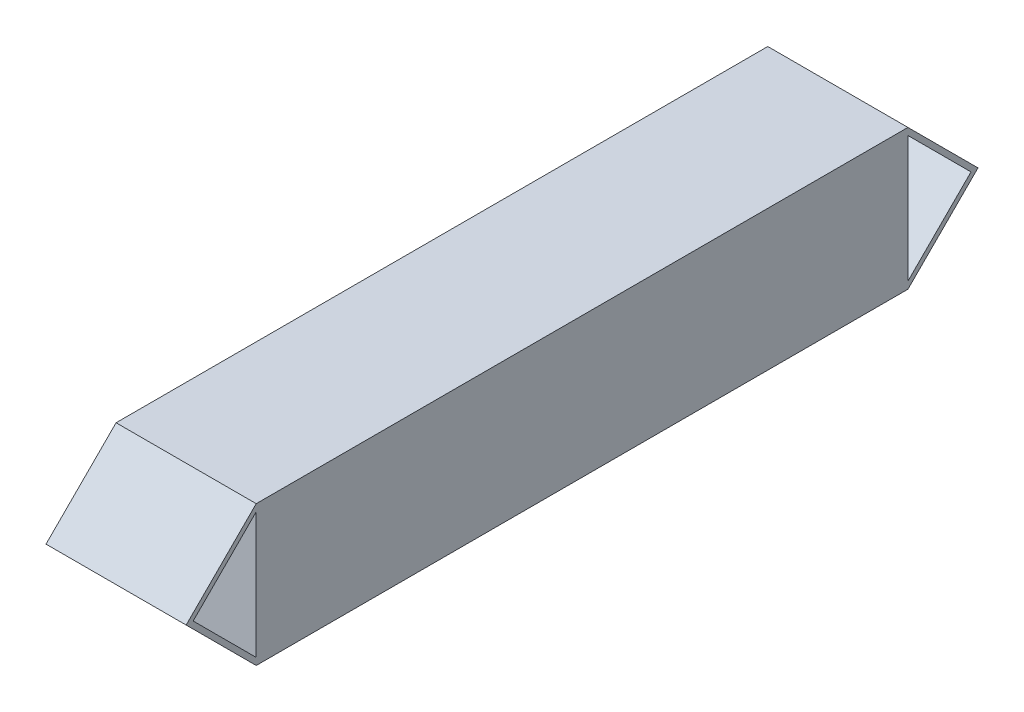
ISO-10303-21;
HEADER;
FILE_DESCRIPTION(('STEP AP214'),'2;1');
FILE_NAME('part.step','',(''),(''),'','','');
FILE_SCHEMA(('AUTOMOTIVE_DESIGN { 1 0 10303 214 1 1 1 1 }'));
ENDSEC;
DATA;
#1=APPLICATION_CONTEXT('core data for automotive mechanical design processes');
#2=APPLICATION_PROTOCOL_DEFINITION('international standard','automotive_design',2000,#1);
#3=PRODUCT_CONTEXT('',#1,'mechanical');
#4=PRODUCT('Part','Part','',(#3));
#5=PRODUCT_RELATED_PRODUCT_CATEGORY('part','',(#4));
#6=PRODUCT_DEFINITION_FORMATION('','',#4);
#7=PRODUCT_DEFINITION_CONTEXT('part definition',#1,'design');
#8=PRODUCT_DEFINITION('design','',#6,#7);
#9=PRODUCT_DEFINITION_SHAPE('','',#8);
#10=(LENGTH_UNIT() NAMED_UNIT(*) SI_UNIT(.MILLI.,.METRE.));
#11=(NAMED_UNIT(*) PLANE_ANGLE_UNIT() SI_UNIT($,.RADIAN.));
#12=(NAMED_UNIT(*) SI_UNIT($,.STERADIAN.) SOLID_ANGLE_UNIT());
#13=UNCERTAINTY_MEASURE_WITH_UNIT(LENGTH_MEASURE(1.E-05),#10,'distance_accuracy_value','');
#14=(GEOMETRIC_REPRESENTATION_CONTEXT(3) GLOBAL_UNCERTAINTY_ASSIGNED_CONTEXT((#13)) GLOBAL_UNIT_ASSIGNED_CONTEXT((#10,
#11,#12)) REPRESENTATION_CONTEXT('',''));
#15=CARTESIAN_POINT('',(0.,0.,0.));
#16=DIRECTION('',(0.,0.,1.));
#17=DIRECTION('',(1.,0.,0.));
#18=AXIS2_PLACEMENT_3D('',#15,#16,#17);
#19=CARTESIAN_POINT('',(0.,0.,186.));
#20=DIRECTION('',(0.,0.,-1.));
#21=DIRECTION('',(-1.,0.,0.));
#22=AXIS2_PLACEMENT_3D('',#19,#20,#21);
#23=PLANE('',#22);
#24=DIRECTION('',(1.,0.,0.));
#25=VECTOR('',#24,1.);
#26=CARTESIAN_POINT('',(-20.,17.9999999999999,186.));
#27=LINE('',#26,#25);
#28=CARTESIAN_POINT('',(-20.,17.9999999999999,186.));
#29=VERTEX_POINT('',#28);
#30=CARTESIAN_POINT('',(20.,18.,186.));
#31=VERTEX_POINT('',#30);
#32=EDGE_CURVE('E72',#29,#31,#27,.T.);
#33=ORIENTED_EDGE('',*,*,#32,.F.);
#34=DIRECTION('',(0.,-1.,0.));
#35=VECTOR('',#34,1.);
#36=CARTESIAN_POINT('',(-20.,-20.,186.));
#37=LINE('',#36,#35);
#38=CARTESIAN_POINT('',(-20.,-18.,186.));
#39=VERTEX_POINT('',#38);
#40=EDGE_CURVE('E67',#29,#39,#37,.T.);
#41=ORIENTED_EDGE('',*,*,#40,.T.);
#42=DIRECTION('',(1.,0.,0.));
#43=VECTOR('',#42,1.);
#44=CARTESIAN_POINT('',(-20.,-17.9999999999999,186.));
#45=LINE('',#44,#43);
#46=CARTESIAN_POINT('',(20.,-17.9999999999999,186.));
#47=VERTEX_POINT('',#46);
#48=EDGE_CURVE('E151',#39,#47,#45,.T.);
#49=ORIENTED_EDGE('',*,*,#48,.T.);
#50=DIRECTION('',(0.,1.,0.));
#51=VECTOR('',#50,1.);
#52=CARTESIAN_POINT('',(20.,-20.,186.));
#53=LINE('',#52,#51);
#54=EDGE_CURVE('E216',#47,#31,#53,.T.);
#55=ORIENTED_EDGE('',*,*,#54,.T.);
#56=EDGE_LOOP('',(#33,#41,#49,#55));
#57=FACE_BOUND('',#56,.T.);
#58=ADVANCED_FACE('F52',(#57),#23,.F.);
#59=CARTESIAN_POINT('',(0.,0.,0.));
#60=DIRECTION('',(0.,0.,-1.));
#61=DIRECTION('',(-1.,0.,0.));
#62=AXIS2_PLACEMENT_3D('',#59,#60,#61);
#63=PLANE('',#62);
#64=DIRECTION('',(0.,1.,0.));
#65=VECTOR('',#64,1.);
#66=CARTESIAN_POINT('',(20.,-20.,0.));
#67=LINE('',#66,#65);
#68=CARTESIAN_POINT('',(20.,-18.,0.));
#69=VERTEX_POINT('',#68);
#70=CARTESIAN_POINT('',(20.,18.,0.));
#71=VERTEX_POINT('',#70);
#72=EDGE_CURVE('E208',#69,#71,#67,.T.);
#73=ORIENTED_EDGE('',*,*,#72,.F.);
#74=DIRECTION('',(1.,0.,0.));
#75=VECTOR('',#74,1.);
#76=CARTESIAN_POINT('',(-20.,-18.,0.));
#77=LINE('',#76,#75);
#78=CARTESIAN_POINT('',(-20.,-18.,0.));
#79=VERTEX_POINT('',#78);
#80=EDGE_CURVE('E197',#79,#69,#77,.T.);
#81=ORIENTED_EDGE('',*,*,#80,.F.);
#82=DIRECTION('',(0.,-1.,0.));
#83=VECTOR('',#82,1.);
#84=CARTESIAN_POINT('',(-20.,-20.,0.));
#85=LINE('',#84,#83);
#86=CARTESIAN_POINT('',(-20.,18.,0.));
#87=VERTEX_POINT('',#86);
#88=EDGE_CURVE('E229',#87,#79,#85,.T.);
#89=ORIENTED_EDGE('',*,*,#88,.F.);
#90=DIRECTION('',(1.,0.,0.));
#91=VECTOR('',#90,1.);
#92=CARTESIAN_POINT('',(-20.,18.,0.));
#93=LINE('',#92,#91);
#94=EDGE_CURVE('E209',#87,#71,#93,.T.);
#95=ORIENTED_EDGE('',*,*,#94,.T.);
#96=EDGE_LOOP('',(#73,#81,#89,#95));
#97=FACE_BOUND('',#96,.T.);
#98=ADVANCED_FACE('F253',(#97),#63,.T.);
#99=CARTESIAN_POINT('',(20.,-20.,186.));
#100=DIRECTION('',(-1.,0.,0.));
#101=DIRECTION('',(0.,0.,1.));
#102=AXIS2_PLACEMENT_3D('',#99,#100,#101);
#103=PLANE('',#102);
#104=DIRECTION('',(0.,-0.707106781186547,0.707106781186548));
#105=VECTOR('',#104,1.);
#106=CARTESIAN_POINT('',(20.,102.,102.));
#107=LINE('',#106,#105);
#108=CARTESIAN_POINT('',(20.,0.,204.));
#109=VERTEX_POINT('',#108);
#110=EDGE_CURVE('E162',#31,#109,#107,.T.);
#111=ORIENTED_EDGE('',*,*,#110,.F.);
#112=ORIENTED_EDGE('',*,*,#54,.F.);
#113=DIRECTION('',(0.,0.707106781186547,0.707106781186548));
#114=VECTOR('',#113,1.);
#115=CARTESIAN_POINT('',(20.,-102.,102.));
#116=LINE('',#115,#114);
#117=EDGE_CURVE('E177',#47,#109,#116,.T.);
#118=ORIENTED_EDGE('',*,*,#117,.T.);
#119=EDGE_LOOP('',(#111,#112,#118));
#120=FACE_BOUND('',#119,.T.);
#121=DIRECTION('',(0.,0.707106781186548,0.707106781186548));
#122=VECTOR('',#121,1.);
#123=CARTESIAN_POINT('',(20.,10.,-10.));
#124=LINE('',#123,#122);
#125=CARTESIAN_POINT('',(20.,0.,-20.));
#126=VERTEX_POINT('',#125);
#127=CARTESIAN_POINT('',(20.,20.,0.));
#128=VERTEX_POINT('',#127);
#129=EDGE_CURVE('E202',#126,#128,#124,.T.);
#130=ORIENTED_EDGE('',*,*,#129,.T.);
#131=DIRECTION('',(0.,0.,-1.));
#132=VECTOR('',#131,1.);
#133=CARTESIAN_POINT('',(20.,20.,186.));
#134=LINE('',#133,#132);
#135=CARTESIAN_POINT('',(20.,20.,186.));
#136=VERTEX_POINT('',#135);
#137=EDGE_CURVE('E12',#136,#128,#134,.T.);
#138=ORIENTED_EDGE('',*,*,#137,.F.);
#139=DIRECTION('',(0.,0.707106781186548,-0.707106781186547));
#140=VECTOR('',#139,1.);
#141=CARTESIAN_POINT('',(20.,103.,103.));
#142=LINE('',#141,#140);
#143=CARTESIAN_POINT('',(20.,0.,206.));
#144=VERTEX_POINT('',#143);
#145=EDGE_CURVE('E174',#144,#136,#142,.T.);
#146=ORIENTED_EDGE('',*,*,#145,.F.);
#147=DIRECTION('',(0.,-0.707106781186548,-0.707106781186547));
#148=VECTOR('',#147,1.);
#149=CARTESIAN_POINT('',(20.,-103.,103.));
#150=LINE('',#149,#148);
#151=CARTESIAN_POINT('',(20.,-20.,186.));
#152=VERTEX_POINT('',#151);
#153=EDGE_CURVE('E147',#144,#152,#150,.T.);
#154=ORIENTED_EDGE('',*,*,#153,.T.);
#155=DIRECTION('',(0.,0.,-1.));
#156=VECTOR('',#155,1.);
#157=CARTESIAN_POINT('',(20.,-20.,186.));
#158=LINE('',#157,#156);
#159=CARTESIAN_POINT('',(20.,-20.,0.));
#160=VERTEX_POINT('',#159);
#161=EDGE_CURVE('E223',#152,#160,#158,.T.);
#162=ORIENTED_EDGE('',*,*,#161,.T.);
#163=DIRECTION('',(0.,-0.707106781186548,0.707106781186548));
#164=VECTOR('',#163,1.);
#165=CARTESIAN_POINT('',(20.,-10.,-10.));
#166=LINE('',#165,#164);
#167=EDGE_CURVE('E200',#126,#160,#166,.T.);
#168=ORIENTED_EDGE('',*,*,#167,.F.);
#169=EDGE_LOOP('',(#130,#138,#146,#154,#162,#168));
#170=FACE_BOUND('',#169,.T.);
#171=ORIENTED_EDGE('',*,*,#72,.T.);
#172=DIRECTION('',(0.,-0.707106781186548,-0.707106781186548));
#173=VECTOR('',#172,1.);
#174=CARTESIAN_POINT('',(20.,9.,-9.));
#175=LINE('',#174,#173);
#176=CARTESIAN_POINT('',(20.,0.,-18.));
#177=VERTEX_POINT('',#176);
#178=EDGE_CURVE('E190',#71,#177,#175,.T.);
#179=ORIENTED_EDGE('',*,*,#178,.T.);
#180=DIRECTION('',(0.,0.707106781186548,-0.707106781186548));
#181=VECTOR('',#180,1.);
#182=CARTESIAN_POINT('',(20.,-9.,-9.));
#183=LINE('',#182,#181);
#184=EDGE_CURVE('E183',#69,#177,#183,.T.);
#185=ORIENTED_EDGE('',*,*,#184,.F.);
#186=EDGE_LOOP('',(#171,#179,#185));
#187=FACE_BOUND('',#186,.T.);
#188=ADVANCED_FACE('F54',(#120,#170,#187),#103,.F.);
#189=CARTESIAN_POINT('',(-20.,20.,186.));
#190=DIRECTION('',(0.,-1.,0.));
#191=DIRECTION('',(0.,0.,-1.));
#192=AXIS2_PLACEMENT_3D('',#189,#190,#191);
#193=PLANE('',#192);
#194=DIRECTION('',(-1.,0.,0.));
#195=VECTOR('',#194,1.);
#196=CARTESIAN_POINT('',(-20.,20.,0.));
#197=LINE('',#196,#195);
#198=CARTESIAN_POINT('',(-20.,20.,0.));
#199=VERTEX_POINT('',#198);
#200=EDGE_CURVE('E226',#128,#199,#197,.T.);
#201=ORIENTED_EDGE('',*,*,#200,.T.);
#202=DIRECTION('',(0.,0.,-1.));
#203=VECTOR('',#202,1.);
#204=CARTESIAN_POINT('',(-20.,20.,186.));
#205=LINE('',#204,#203);
#206=CARTESIAN_POINT('',(-20.,20.,186.));
#207=VERTEX_POINT('',#206);
#208=EDGE_CURVE('E60',#207,#199,#205,.T.);
#209=ORIENTED_EDGE('',*,*,#208,.F.);
#210=DIRECTION('',(-1.,0.,0.));
#211=VECTOR('',#210,1.);
#212=CARTESIAN_POINT('',(-20.,20.,186.));
#213=LINE('',#212,#211);
#214=EDGE_CURVE('E159',#136,#207,#213,.T.);
#215=ORIENTED_EDGE('',*,*,#214,.F.);
#216=ORIENTED_EDGE('',*,*,#137,.T.);
#217=EDGE_LOOP('',(#201,#209,#215,#216));
#218=FACE_BOUND('',#217,.T.);
#219=ADVANCED_FACE('F238',(#218),#193,.F.);
#220=CARTESIAN_POINT('',(-20.,-20.,186.));
#221=DIRECTION('',(1.,0.,0.));
#222=DIRECTION('',(0.,0.,-1.));
#223=AXIS2_PLACEMENT_3D('',#220,#221,#222);
#224=PLANE('',#223);
#225=ORIENTED_EDGE('',*,*,#40,.F.);
#226=DIRECTION('',(0.,-0.707106781186547,0.707106781186548));
#227=VECTOR('',#226,1.);
#228=CARTESIAN_POINT('',(-20.,102.,102.));
#229=LINE('',#228,#227);
#230=CARTESIAN_POINT('',(-20.,0.,204.));
#231=VERTEX_POINT('',#230);
#232=EDGE_CURVE('E152',#29,#231,#229,.T.);
#233=ORIENTED_EDGE('',*,*,#232,.T.);
#234=DIRECTION('',(0.,0.707106781186547,0.707106781186548));
#235=VECTOR('',#234,1.);
#236=CARTESIAN_POINT('',(-20.,-102.,102.));
#237=LINE('',#236,#235);
#238=EDGE_CURVE('E168',#39,#231,#237,.T.);
#239=ORIENTED_EDGE('',*,*,#238,.F.);
#240=EDGE_LOOP('',(#225,#233,#239));
#241=FACE_BOUND('',#240,.T.);
#242=DIRECTION('',(0.,-0.707106781186548,-0.707106781186548));
#243=VECTOR('',#242,1.);
#244=CARTESIAN_POINT('',(-20.,9.,-9.));
#245=LINE('',#244,#243);
#246=CARTESIAN_POINT('',(-20.,0.,-18.));
#247=VERTEX_POINT('',#246);
#248=EDGE_CURVE('E194',#87,#247,#245,.T.);
#249=ORIENTED_EDGE('',*,*,#248,.F.);
#250=ORIENTED_EDGE('',*,*,#88,.T.);
#251=DIRECTION('',(0.,0.707106781186548,-0.707106781186548));
#252=VECTOR('',#251,1.);
#253=CARTESIAN_POINT('',(-20.,-9.,-9.));
#254=LINE('',#253,#252);
#255=EDGE_CURVE('E187',#79,#247,#254,.T.);
#256=ORIENTED_EDGE('',*,*,#255,.T.);
#257=EDGE_LOOP('',(#249,#250,#256));
#258=FACE_BOUND('',#257,.T.);
#259=ORIENTED_EDGE('',*,*,#208,.T.);
#260=DIRECTION('',(0.,0.707106781186548,0.707106781186548));
#261=VECTOR('',#260,1.);
#262=CARTESIAN_POINT('',(-20.,10.,-10.));
#263=LINE('',#262,#261);
#264=CARTESIAN_POINT('',(-20.,0.,-20.));
#265=VERTEX_POINT('',#264);
#266=EDGE_CURVE('E192',#265,#199,#263,.T.);
#267=ORIENTED_EDGE('',*,*,#266,.F.);
#268=DIRECTION('',(0.,-0.707106781186548,0.707106781186548));
#269=VECTOR('',#268,1.);
#270=CARTESIAN_POINT('',(-20.,-10.,-10.));
#271=LINE('',#270,#269);
#272=CARTESIAN_POINT('',(-20.,-20.,0.));
#273=VERTEX_POINT('',#272);
#274=EDGE_CURVE('E189',#265,#273,#271,.T.);
#275=ORIENTED_EDGE('',*,*,#274,.T.);
#276=DIRECTION('',(0.,0.,-1.));
#277=VECTOR('',#276,1.);
#278=CARTESIAN_POINT('',(-20.,-20.,186.));
#279=LINE('',#278,#277);
#280=CARTESIAN_POINT('',(-20.,-20.,186.));
#281=VERTEX_POINT('',#280);
#282=EDGE_CURVE('E166',#281,#273,#279,.T.);
#283=ORIENTED_EDGE('',*,*,#282,.F.);
#284=DIRECTION('',(0.,-0.707106781186548,-0.707106781186547));
#285=VECTOR('',#284,1.);
#286=CARTESIAN_POINT('',(-20.,-103.,103.));
#287=LINE('',#286,#285);
#288=CARTESIAN_POINT('',(-20.,0.,206.));
#289=VERTEX_POINT('',#288);
#290=EDGE_CURVE('E145',#289,#281,#287,.T.);
#291=ORIENTED_EDGE('',*,*,#290,.F.);
#292=DIRECTION('',(0.,0.707106781186548,-0.707106781186547));
#293=VECTOR('',#292,1.);
#294=CARTESIAN_POINT('',(-20.,103.,103.));
#295=LINE('',#294,#293);
#296=EDGE_CURVE('E156',#289,#207,#295,.T.);
#297=ORIENTED_EDGE('',*,*,#296,.T.);
#298=EDGE_LOOP('',(#259,#267,#275,#283,#291,#297));
#299=FACE_BOUND('',#298,.T.);
#300=ADVANCED_FACE('F164',(#241,#258,#299),#224,.F.);
#301=CARTESIAN_POINT('',(-20.,-20.,186.));
#302=DIRECTION('',(0.,1.,0.));
#303=DIRECTION('',(0.,0.,1.));
#304=AXIS2_PLACEMENT_3D('',#301,#302,#303);
#305=PLANE('',#304);
#306=DIRECTION('',(1.,0.,0.));
#307=VECTOR('',#306,1.);
#308=CARTESIAN_POINT('',(-20.,-20.,0.));
#309=LINE('',#308,#307);
#310=EDGE_CURVE('E218',#273,#160,#309,.T.);
#311=ORIENTED_EDGE('',*,*,#310,.T.);
#312=ORIENTED_EDGE('',*,*,#161,.F.);
#313=DIRECTION('',(1.,0.,0.));
#314=VECTOR('',#313,1.);
#315=CARTESIAN_POINT('',(-20.,-20.,186.));
#316=LINE('',#315,#314);
#317=EDGE_CURVE('E221',#281,#152,#316,.T.);
#318=ORIENTED_EDGE('',*,*,#317,.F.);
#319=ORIENTED_EDGE('',*,*,#282,.T.);
#320=EDGE_LOOP('',(#311,#312,#318,#319));
#321=FACE_BOUND('',#320,.T.);
#322=ADVANCED_FACE('F249',(#321),#305,.F.);
#323=CARTESIAN_POINT('',(-20.,-9.,-9.));
#324=DIRECTION('',(0.,-0.707106781186548,-0.707106781186548));
#325=DIRECTION('',(0.,0.707106781186548,-0.707106781186548));
#326=AXIS2_PLACEMENT_3D('',#323,#324,#325);
#327=PLANE('',#326);
#328=ORIENTED_EDGE('',*,*,#184,.T.);
#329=DIRECTION('',(1.,0.,0.));
#330=VECTOR('',#329,1.);
#331=CARTESIAN_POINT('',(-20.,0.,-18.));
#332=LINE('',#331,#330);
#333=EDGE_CURVE('E206',#247,#177,#332,.T.);
#334=ORIENTED_EDGE('',*,*,#333,.F.);
#335=ORIENTED_EDGE('',*,*,#255,.F.);
#336=ORIENTED_EDGE('',*,*,#80,.T.);
#337=EDGE_LOOP('',(#328,#334,#335,#336));
#338=FACE_BOUND('',#337,.T.);
#339=ADVANCED_FACE('F265',(#338),#327,.F.);
#340=CARTESIAN_POINT('',(-20.,9.,-9.));
#341=DIRECTION('',(0.,-0.707106781186548,0.707106781186548));
#342=DIRECTION('',(0.,-0.707106781186548,-0.707106781186548));
#343=AXIS2_PLACEMENT_3D('',#340,#341,#342);
#344=PLANE('',#343);
#345=ORIENTED_EDGE('',*,*,#178,.F.);
#346=ORIENTED_EDGE('',*,*,#94,.F.);
#347=ORIENTED_EDGE('',*,*,#248,.T.);
#348=ORIENTED_EDGE('',*,*,#333,.T.);
#349=EDGE_LOOP('',(#345,#346,#347,#348));
#350=FACE_BOUND('',#349,.T.);
#351=ADVANCED_FACE('F261',(#350),#344,.T.);
#352=CARTESIAN_POINT('',(-20.,10.,-10.));
#353=DIRECTION('',(0.,0.707106781186548,-0.707106781186548));
#354=DIRECTION('',(0.,0.707106781186548,0.707106781186548));
#355=AXIS2_PLACEMENT_3D('',#352,#353,#354);
#356=PLANE('',#355);
#357=ORIENTED_EDGE('',*,*,#129,.F.);
#358=DIRECTION('',(1.,0.,0.));
#359=VECTOR('',#358,1.);
#360=CARTESIAN_POINT('',(-20.,0.,-20.));
#361=LINE('',#360,#359);
#362=EDGE_CURVE('E212',#265,#126,#361,.T.);
#363=ORIENTED_EDGE('',*,*,#362,.F.);
#364=ORIENTED_EDGE('',*,*,#266,.T.);
#365=ORIENTED_EDGE('',*,*,#200,.F.);
#366=EDGE_LOOP('',(#357,#363,#364,#365));
#367=FACE_BOUND('',#366,.T.);
#368=ADVANCED_FACE('F242',(#367),#356,.T.);
#369=CARTESIAN_POINT('',(-20.,-10.,-10.));
#370=DIRECTION('',(0.,0.707106781186548,0.707106781186548));
#371=DIRECTION('',(0.,-0.707106781186548,0.707106781186548));
#372=AXIS2_PLACEMENT_3D('',#369,#370,#371);
#373=PLANE('',#372);
#374=ORIENTED_EDGE('',*,*,#167,.T.);
#375=ORIENTED_EDGE('',*,*,#310,.F.);
#376=ORIENTED_EDGE('',*,*,#274,.F.);
#377=ORIENTED_EDGE('',*,*,#362,.T.);
#378=EDGE_LOOP('',(#374,#375,#376,#377));
#379=FACE_BOUND('',#378,.T.);
#380=ADVANCED_FACE('F247',(#379),#373,.F.);
#381=CARTESIAN_POINT('',(-20.,103.,103.));
#382=DIRECTION('',(0.,-0.707106781186547,-0.707106781186548));
#383=DIRECTION('',(0.,0.707106781186548,-0.707106781186547));
#384=AXIS2_PLACEMENT_3D('',#381,#382,#383);
#385=PLANE('',#384);
#386=ORIENTED_EDGE('',*,*,#145,.T.);
#387=ORIENTED_EDGE('',*,*,#214,.T.);
#388=ORIENTED_EDGE('',*,*,#296,.F.);
#389=DIRECTION('',(1.,0.,0.));
#390=VECTOR('',#389,1.);
#391=CARTESIAN_POINT('',(-20.,0.,206.));
#392=LINE('',#391,#390);
#393=EDGE_CURVE('E140',#289,#144,#392,.T.);
#394=ORIENTED_EDGE('',*,*,#393,.T.);
#395=EDGE_LOOP('',(#386,#387,#388,#394));
#396=FACE_BOUND('',#395,.T.);
#397=ADVANCED_FACE('F157',(#396),#385,.F.);
#398=CARTESIAN_POINT('',(-20.,102.,102.));
#399=DIRECTION('',(0.,0.707106781186548,0.707106781186547));
#400=DIRECTION('',(0.,-0.707106781186547,0.707106781186548));
#401=AXIS2_PLACEMENT_3D('',#398,#399,#400);
#402=PLANE('',#401);
#403=ORIENTED_EDGE('',*,*,#110,.T.);
#404=DIRECTION('',(1.,0.,0.));
#405=VECTOR('',#404,1.);
#406=CARTESIAN_POINT('',(-20.,0.,204.));
#407=LINE('',#406,#405);
#408=EDGE_CURVE('E184',#231,#109,#407,.T.);
#409=ORIENTED_EDGE('',*,*,#408,.F.);
#410=ORIENTED_EDGE('',*,*,#232,.F.);
#411=ORIENTED_EDGE('',*,*,#32,.T.);
#412=EDGE_LOOP('',(#403,#409,#410,#411));
#413=FACE_BOUND('',#412,.T.);
#414=ADVANCED_FACE('F369',(#413),#402,.F.);
#415=CARTESIAN_POINT('',(-20.,-102.,102.));
#416=DIRECTION('',(0.,0.707106781186548,-0.707106781186547));
#417=DIRECTION('',(0.,0.707106781186547,0.707106781186548));
#418=AXIS2_PLACEMENT_3D('',#415,#416,#417);
#419=PLANE('',#418);
#420=ORIENTED_EDGE('',*,*,#117,.F.);
#421=ORIENTED_EDGE('',*,*,#48,.F.);
#422=ORIENTED_EDGE('',*,*,#238,.T.);
#423=ORIENTED_EDGE('',*,*,#408,.T.);
#424=EDGE_LOOP('',(#420,#421,#422,#423));
#425=FACE_BOUND('',#424,.T.);
#426=ADVANCED_FACE('F377',(#425),#419,.T.);
#427=CARTESIAN_POINT('',(-20.,-103.,103.));
#428=DIRECTION('',(0.,-0.707106781186547,0.707106781186548));
#429=DIRECTION('',(0.,-0.707106781186548,-0.707106781186547));
#430=AXIS2_PLACEMENT_3D('',#427,#428,#429);
#431=PLANE('',#430);
#432=ORIENTED_EDGE('',*,*,#153,.F.);
#433=ORIENTED_EDGE('',*,*,#393,.F.);
#434=ORIENTED_EDGE('',*,*,#290,.T.);
#435=ORIENTED_EDGE('',*,*,#317,.T.);
#436=EDGE_LOOP('',(#432,#433,#434,#435));
#437=FACE_BOUND('',#436,.T.);
#438=ADVANCED_FACE('F142',(#437),#431,.T.);
#439=CLOSED_SHELL('',(#58,#98,#188,#219,#300,#322,#339,#351,#368,#380,#397,#414,#426,#438));
#440=MANIFOLD_SOLID_BREP('B2',#439);
#441=ADVANCED_BREP_SHAPE_REPRESENTATION('',(#18,#440),#14);
#442=SHAPE_DEFINITION_REPRESENTATION(#9,#441);
ENDSEC;
END-ISO-10303-21;
